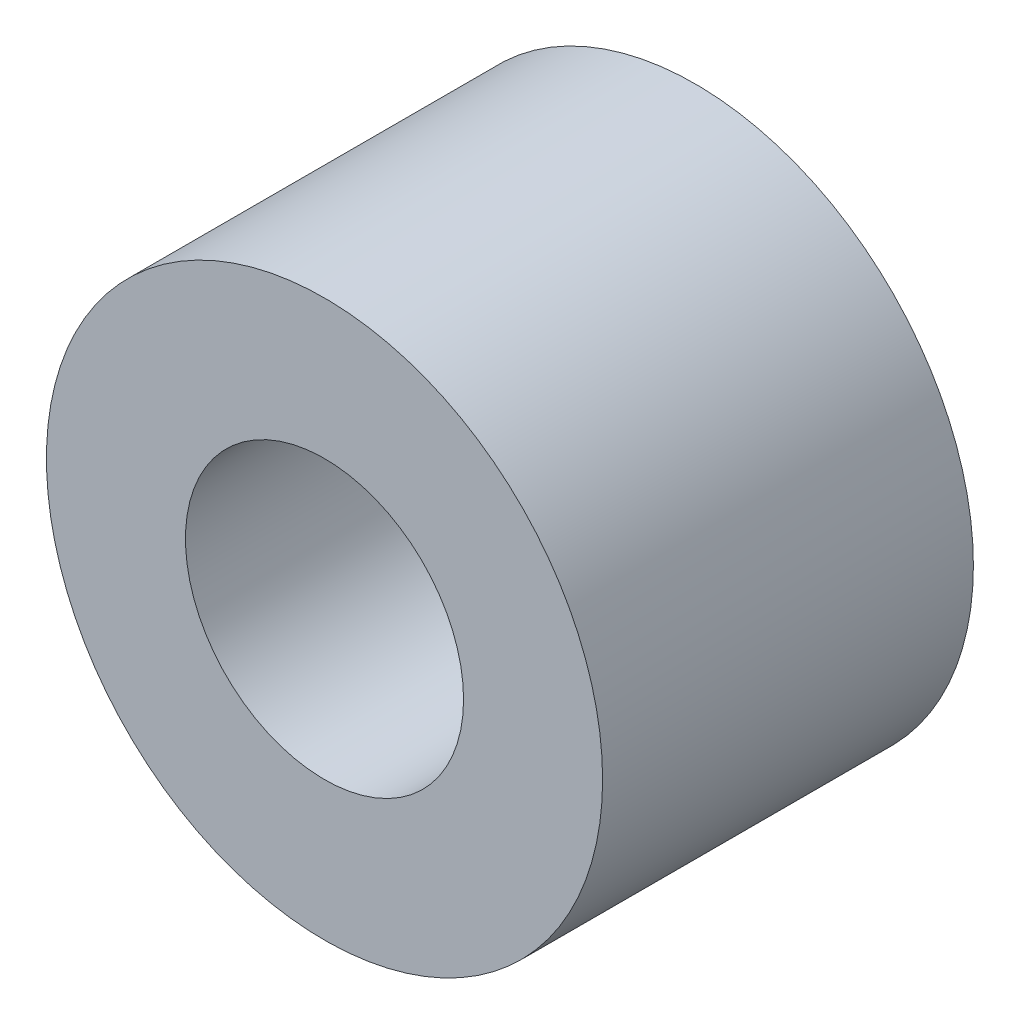
ISO-10303-21;
HEADER;
FILE_DESCRIPTION(('STEP AP214'),'2;1');
FILE_NAME('part.step','',(''),(''),'','','');
FILE_SCHEMA(('AUTOMOTIVE_DESIGN { 1 0 10303 214 1 1 1 1 }'));
ENDSEC;
DATA;
#1=APPLICATION_CONTEXT('core data for automotive mechanical design processes');
#2=APPLICATION_PROTOCOL_DEFINITION('international standard','automotive_design',2000,#1);
#3=PRODUCT_CONTEXT('',#1,'mechanical');
#4=PRODUCT('Part','Part','',(#3));
#5=PRODUCT_RELATED_PRODUCT_CATEGORY('part','',(#4));
#6=PRODUCT_DEFINITION_FORMATION('','',#4);
#7=PRODUCT_DEFINITION_CONTEXT('part definition',#1,'design');
#8=PRODUCT_DEFINITION('design','',#6,#7);
#9=PRODUCT_DEFINITION_SHAPE('','',#8);
#10=(LENGTH_UNIT() NAMED_UNIT(*) SI_UNIT(.MILLI.,.METRE.));
#11=(NAMED_UNIT(*) PLANE_ANGLE_UNIT() SI_UNIT($,.RADIAN.));
#12=(NAMED_UNIT(*) SI_UNIT($,.STERADIAN.) SOLID_ANGLE_UNIT());
#13=UNCERTAINTY_MEASURE_WITH_UNIT(LENGTH_MEASURE(1.E-05),#10,'distance_accuracy_value','');
#14=(GEOMETRIC_REPRESENTATION_CONTEXT(3) GLOBAL_UNCERTAINTY_ASSIGNED_CONTEXT((#13)) GLOBAL_UNIT_ASSIGNED_CONTEXT((#10,
#11,#12)) REPRESENTATION_CONTEXT('',''));
#15=CARTESIAN_POINT('',(0.,0.,0.));
#16=DIRECTION('',(0.,0.,1.));
#17=DIRECTION('',(1.,0.,0.));
#18=AXIS2_PLACEMENT_3D('',#15,#16,#17);
#19=CARTESIAN_POINT('',(0.,0.,2.));
#20=DIRECTION('',(0.,0.,1.));
#21=DIRECTION('',(1.,0.,0.));
#22=AXIS2_PLACEMENT_3D('',#19,#20,#21);
#23=PLANE('',#22);
#24=CARTESIAN_POINT('',(0.,0.,2.));
#25=DIRECTION('',(0.,0.,1.));
#26=DIRECTION('',(1.,0.,0.));
#27=AXIS2_PLACEMENT_3D('',#24,#25,#26);
#28=CIRCLE('',#27,1.5);
#29=CARTESIAN_POINT('',(1.5,0.,2.));
#30=VERTEX_POINT('',#29);
#31=EDGE_CURVE('E10',#30,#30,#28,.T.);
#32=ORIENTED_EDGE('',*,*,#31,.T.);
#33=EDGE_LOOP('',(#32));
#34=FACE_BOUND('',#33,.T.);
#35=CARTESIAN_POINT('',(0.,0.,2.));
#36=DIRECTION('',(0.,0.,1.));
#37=DIRECTION('',(1.,0.,0.));
#38=AXIS2_PLACEMENT_3D('',#35,#36,#37);
#39=CIRCLE('',#38,0.75);
#40=CARTESIAN_POINT('',(0.75,0.,2.));
#41=VERTEX_POINT('',#40);
#42=EDGE_CURVE('E50',#41,#41,#39,.T.);
#43=ORIENTED_EDGE('',*,*,#42,.F.);
#44=EDGE_LOOP('',(#43));
#45=FACE_BOUND('',#44,.T.);
#46=ADVANCED_FACE('F37',(#34,#45),#23,.T.);
#47=CARTESIAN_POINT('',(0.,0.,0.));
#48=DIRECTION('',(0.,0.,1.));
#49=DIRECTION('',(1.,0.,0.));
#50=AXIS2_PLACEMENT_3D('',#47,#48,#49);
#51=PLANE('',#50);
#52=CARTESIAN_POINT('',(0.,0.,0.));
#53=DIRECTION('',(0.,0.,1.));
#54=DIRECTION('',(1.,0.,0.));
#55=AXIS2_PLACEMENT_3D('',#52,#53,#54);
#56=CIRCLE('',#55,1.5);
#57=CARTESIAN_POINT('',(1.5,0.,0.));
#58=VERTEX_POINT('',#57);
#59=EDGE_CURVE('E41',#58,#58,#56,.T.);
#60=ORIENTED_EDGE('',*,*,#59,.F.);
#61=EDGE_LOOP('',(#60));
#62=FACE_BOUND('',#61,.T.);
#63=CARTESIAN_POINT('',(0.,0.,0.));
#64=DIRECTION('',(0.,0.,1.));
#65=DIRECTION('',(1.,0.,0.));
#66=AXIS2_PLACEMENT_3D('',#63,#64,#65);
#67=CIRCLE('',#66,0.75);
#68=CARTESIAN_POINT('',(0.75,0.,0.));
#69=VERTEX_POINT('',#68);
#70=EDGE_CURVE('E52',#69,#69,#67,.T.);
#71=ORIENTED_EDGE('',*,*,#70,.T.);
#72=EDGE_LOOP('',(#71));
#73=FACE_BOUND('',#72,.T.);
#74=ADVANCED_FACE('F64',(#62,#73),#51,.F.);
#75=CARTESIAN_POINT('',(0.,0.,2.));
#76=DIRECTION('',(0.,0.,-1.));
#77=DIRECTION('',(-1.,0.,0.));
#78=AXIS2_PLACEMENT_3D('',#75,#76,#77);
#79=CYLINDRICAL_SURFACE('',#78,1.5);
#80=ORIENTED_EDGE('',*,*,#31,.F.);
#81=EDGE_LOOP('',(#80));
#82=FACE_BOUND('',#81,.T.);
#83=ORIENTED_EDGE('',*,*,#59,.T.);
#84=EDGE_LOOP('',(#83));
#85=FACE_BOUND('',#84,.T.);
#86=ADVANCED_FACE('F39',(#82,#85),#79,.T.);
#87=CARTESIAN_POINT('',(0.,0.,2.));
#88=DIRECTION('',(0.,0.,-1.));
#89=DIRECTION('',(-1.,0.,0.));
#90=AXIS2_PLACEMENT_3D('',#87,#88,#89);
#91=CYLINDRICAL_SURFACE('',#90,0.75);
#92=ORIENTED_EDGE('',*,*,#42,.T.);
#93=EDGE_LOOP('',(#92));
#94=FACE_BOUND('',#93,.T.);
#95=ORIENTED_EDGE('',*,*,#70,.F.);
#96=EDGE_LOOP('',(#95));
#97=FACE_BOUND('',#96,.T.);
#98=ADVANCED_FACE('F60',(#94,#97),#91,.F.);
#99=CLOSED_SHELL('',(#46,#74,#86,#98));
#100=MANIFOLD_SOLID_BREP('B2',#99);
#101=ADVANCED_BREP_SHAPE_REPRESENTATION('',(#18,#100),#14);
#102=SHAPE_DEFINITION_REPRESENTATION(#9,#101);
ENDSEC;
END-ISO-10303-21;
